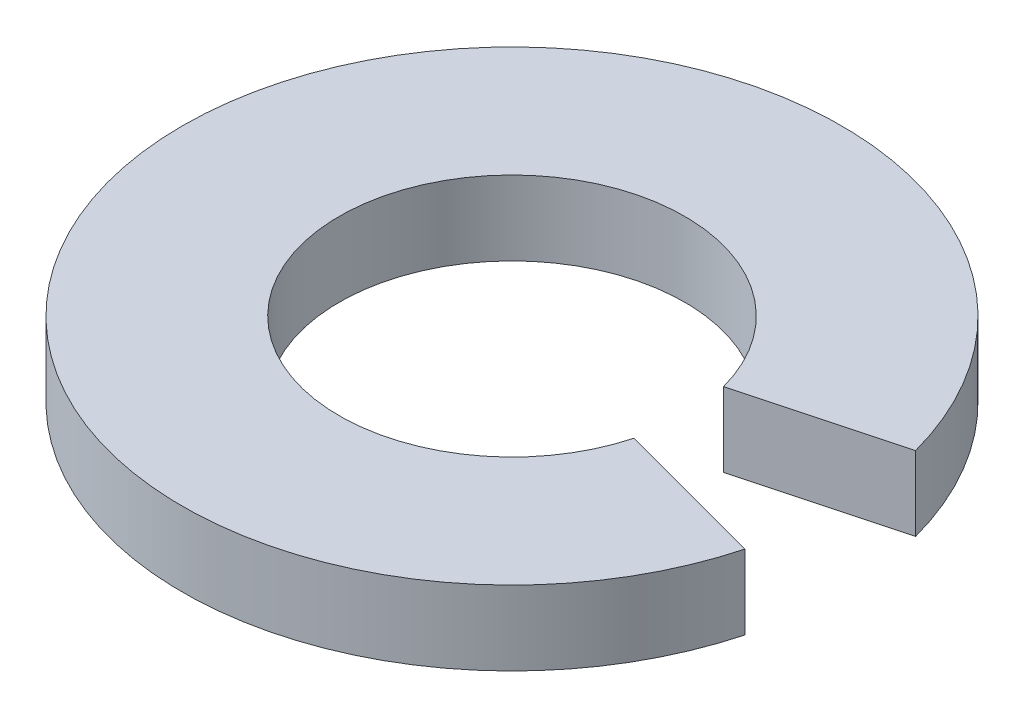
ISO-10303-21;
HEADER;
FILE_DESCRIPTION(('STEP AP214'),'2;1');
FILE_NAME('part.step','',(''),(''),'','','');
FILE_SCHEMA(('AUTOMOTIVE_DESIGN { 1 0 10303 214 1 1 1 1 }'));
ENDSEC;
DATA;
#1=APPLICATION_CONTEXT('core data for automotive mechanical design processes');
#2=APPLICATION_PROTOCOL_DEFINITION('international standard','automotive_design',2000,#1);
#3=PRODUCT_CONTEXT('',#1,'mechanical');
#4=PRODUCT('Part','Part','',(#3));
#5=PRODUCT_RELATED_PRODUCT_CATEGORY('part','',(#4));
#6=PRODUCT_DEFINITION_FORMATION('','',#4);
#7=PRODUCT_DEFINITION_CONTEXT('part definition',#1,'design');
#8=PRODUCT_DEFINITION('design','',#6,#7);
#9=PRODUCT_DEFINITION_SHAPE('','',#8);
#10=(LENGTH_UNIT() NAMED_UNIT(*) SI_UNIT(.MILLI.,.METRE.));
#11=(NAMED_UNIT(*) PLANE_ANGLE_UNIT() SI_UNIT($,.RADIAN.));
#12=(NAMED_UNIT(*) SI_UNIT($,.STERADIAN.) SOLID_ANGLE_UNIT());
#13=UNCERTAINTY_MEASURE_WITH_UNIT(LENGTH_MEASURE(1.E-05),#10,'distance_accuracy_value','');
#14=(GEOMETRIC_REPRESENTATION_CONTEXT(3) GLOBAL_UNCERTAINTY_ASSIGNED_CONTEXT((#13)) GLOBAL_UNIT_ASSIGNED_CONTEXT((#10,
#11,#12)) REPRESENTATION_CONTEXT('',''));
#15=CARTESIAN_POINT('',(0.,0.,0.));
#16=DIRECTION('',(0.,0.,1.));
#17=DIRECTION('',(1.,0.,0.));
#18=AXIS2_PLACEMENT_3D('',#15,#16,#17);
#19=CARTESIAN_POINT('',(0.,0.7,0.));
#20=DIRECTION('',(0.,1.,0.));
#21=DIRECTION('',(0.,0.,1.));
#22=AXIS2_PLACEMENT_3D('',#19,#20,#21);
#23=PLANE('',#22);
#24=CARTESIAN_POINT('',(0.,0.7,0.));
#25=DIRECTION('',(0.,1.,0.));
#26=DIRECTION('',(0.,0.,1.));
#27=AXIS2_PLACEMENT_3D('',#24,#25,#26);
#28=CIRCLE('',#27,1.625);
#29=CARTESIAN_POINT('',(1.56962946771974,0.7,0.420580948291592));
#30=VERTEX_POINT('',#29);
#31=CARTESIAN_POINT('',(1.56962946771975,0.7,-0.420580948291534));
#32=VERTEX_POINT('',#31);
#33=EDGE_CURVE('E68',#30,#32,#28,.F.);
#34=ORIENTED_EDGE('',*,*,#33,.T.);
#35=DIRECTION('',(0.965925826289076,0.,-0.258819045102493));
#36=VECTOR('',#35,1.);
#37=CARTESIAN_POINT('',(1.56962946772,0.7,-0.4205809482916));
#38=LINE('',#37,#36);
#39=CARTESIAN_POINT('',(2.99437006149612,0.7,-0.802339039817771));
#40=VERTEX_POINT('',#39);
#41=EDGE_CURVE('E66',#40,#32,#38,.F.);
#42=ORIENTED_EDGE('',*,*,#41,.F.);
#43=CARTESIAN_POINT('',(0.,0.7,0.));
#44=DIRECTION('',(0.,1.,0.));
#45=DIRECTION('',(0.,0.,1.));
#46=AXIS2_PLACEMENT_3D('',#43,#44,#45);
#47=CIRCLE('',#46,3.1);
#48=CARTESIAN_POINT('',(2.99437006149605,0.7,0.802339039817815));
#49=VERTEX_POINT('',#48);
#50=EDGE_CURVE('E20',#49,#40,#47,.F.);
#51=ORIENTED_EDGE('',*,*,#50,.F.);
#52=DIRECTION('',(-0.965925826289076,0.,-0.258819045102493));
#53=VECTOR('',#52,1.);
#54=CARTESIAN_POINT('',(2.994370061496,0.7,0.8023390398178));
#55=LINE('',#54,#53);
#56=EDGE_CURVE('E53',#30,#49,#55,.F.);
#57=ORIENTED_EDGE('',*,*,#56,.F.);
#58=EDGE_LOOP('',(#34,#42,#51,#57));
#59=FACE_BOUND('',#58,.T.);
#60=ADVANCED_FACE('F17',(#59),#23,.T.);
#61=CARTESIAN_POINT('',(1.56962946772,0.,-0.4205809482916));
#62=DIRECTION('',(0.258819045102493,0.,0.965925826289076));
#63=DIRECTION('',(0.965925826289076,0.,-0.258819045102493));
#64=AXIS2_PLACEMENT_3D('',#61,#62,#63);
#65=PLANE('',#64);
#66=DIRECTION('',(0.,1.,0.));
#67=VECTOR('',#66,1.);
#68=CARTESIAN_POINT('',(1.56962946771975,0.,-0.420580948291534));
#69=LINE('',#68,#67);
#70=CARTESIAN_POINT('',(1.56962946771975,0.,-0.420580948291534));
#71=VERTEX_POINT('',#70);
#72=EDGE_CURVE('E82',#32,#71,#69,.F.);
#73=ORIENTED_EDGE('',*,*,#72,.T.);
#74=DIRECTION('',(0.965925826289054,0.,-0.258819045102573));
#75=VECTOR('',#74,1.);
#76=CARTESIAN_POINT('',(1.56962946772,0.,-0.4205809482916));
#77=LINE('',#76,#75);
#78=CARTESIAN_POINT('',(2.99437006149611,0.,-0.802339039817829));
#79=VERTEX_POINT('',#78);
#80=EDGE_CURVE('E75',#71,#79,#77,.T.);
#81=ORIENTED_EDGE('',*,*,#80,.T.);
#82=DIRECTION('',(0.,1.,0.));
#83=VECTOR('',#82,1.);
#84=CARTESIAN_POINT('',(2.99437006149611,0.,-0.802339039817829));
#85=LINE('',#84,#83);
#86=EDGE_CURVE('E62',#40,#79,#85,.F.);
#87=ORIENTED_EDGE('',*,*,#86,.F.);
#88=ORIENTED_EDGE('',*,*,#41,.T.);
#89=EDGE_LOOP('',(#73,#81,#87,#88));
#90=FACE_BOUND('',#89,.T.);
#91=ADVANCED_FACE('F74',(#90),#65,.T.);
#92=CARTESIAN_POINT('',(0.,0.,0.));
#93=DIRECTION('',(0.,1.,0.));
#94=DIRECTION('',(0.,0.,1.));
#95=AXIS2_PLACEMENT_3D('',#92,#93,#94);
#96=CYLINDRICAL_SURFACE('',#95,3.1);
#97=ORIENTED_EDGE('',*,*,#86,.T.);
#98=CARTESIAN_POINT('',(0.,0.,0.));
#99=DIRECTION('',(0.,1.,0.));
#100=DIRECTION('',(0.,0.,1.));
#101=AXIS2_PLACEMENT_3D('',#98,#99,#100);
#102=CIRCLE('',#101,3.1);
#103=CARTESIAN_POINT('',(2.99437006149605,0.,0.802339039817814));
#104=VERTEX_POINT('',#103);
#105=EDGE_CURVE('E81',#79,#104,#102,.T.);
#106=ORIENTED_EDGE('',*,*,#105,.T.);
#107=DIRECTION('',(0.,1.,0.));
#108=VECTOR('',#107,1.);
#109=CARTESIAN_POINT('',(2.994370061496,0.,0.8023390398178));
#110=LINE('',#109,#108);
#111=EDGE_CURVE('E64',#49,#104,#110,.F.);
#112=ORIENTED_EDGE('',*,*,#111,.F.);
#113=ORIENTED_EDGE('',*,*,#50,.T.);
#114=EDGE_LOOP('',(#97,#106,#112,#113));
#115=FACE_BOUND('',#114,.T.);
#116=ADVANCED_FACE('F59',(#115),#96,.T.);
#117=CARTESIAN_POINT('',(2.994370061496,0.,0.8023390398178));
#118=DIRECTION('',(0.258819045102493,0.,-0.965925826289076));
#119=DIRECTION('',(-0.965925826289076,0.,-0.258819045102493));
#120=AXIS2_PLACEMENT_3D('',#117,#118,#119);
#121=PLANE('',#120);
#122=ORIENTED_EDGE('',*,*,#111,.T.);
#123=DIRECTION('',(-0.965925826289054,0.,-0.258819045102573));
#124=VECTOR('',#123,1.);
#125=CARTESIAN_POINT('',(2.994370061496,0.,0.8023390398178));
#126=LINE('',#125,#124);
#127=CARTESIAN_POINT('',(1.56962946771975,0.,0.420580948291534));
#128=VERTEX_POINT('',#127);
#129=EDGE_CURVE('E26',#104,#128,#126,.T.);
#130=ORIENTED_EDGE('',*,*,#129,.T.);
#131=DIRECTION('',(0.,1.,0.));
#132=VECTOR('',#131,1.);
#133=CARTESIAN_POINT('',(1.56962946771975,0.,0.420580948291534));
#134=LINE('',#133,#132);
#135=EDGE_CURVE('E34',#128,#30,#134,.T.);
#136=ORIENTED_EDGE('',*,*,#135,.T.);
#137=ORIENTED_EDGE('',*,*,#56,.T.);
#138=EDGE_LOOP('',(#122,#130,#136,#137));
#139=FACE_BOUND('',#138,.T.);
#140=ADVANCED_FACE('F88',(#139),#121,.T.);
#141=CARTESIAN_POINT('',(0.,0.,0.));
#142=DIRECTION('',(0.,1.,0.));
#143=DIRECTION('',(0.,0.,1.));
#144=AXIS2_PLACEMENT_3D('',#141,#142,#143);
#145=CYLINDRICAL_SURFACE('',#144,1.625);
#146=ORIENTED_EDGE('',*,*,#33,.F.);
#147=ORIENTED_EDGE('',*,*,#135,.F.);
#148=CARTESIAN_POINT('',(0.,0.,0.));
#149=DIRECTION('',(0.,1.,0.));
#150=DIRECTION('',(0.,0.,1.));
#151=AXIS2_PLACEMENT_3D('',#148,#149,#150);
#152=CIRCLE('',#151,1.625);
#153=EDGE_CURVE('E11',#128,#71,#152,.F.);
#154=ORIENTED_EDGE('',*,*,#153,.T.);
#155=ORIENTED_EDGE('',*,*,#72,.F.);
#156=EDGE_LOOP('',(#146,#147,#154,#155));
#157=FACE_BOUND('',#156,.T.);
#158=ADVANCED_FACE('F91',(#157),#145,.F.);
#159=CARTESIAN_POINT('',(0.,0.,0.));
#160=DIRECTION('',(0.,1.,0.));
#161=DIRECTION('',(0.,0.,1.));
#162=AXIS2_PLACEMENT_3D('',#159,#160,#161);
#163=PLANE('',#162);
#164=ORIENTED_EDGE('',*,*,#129,.F.);
#165=ORIENTED_EDGE('',*,*,#105,.F.);
#166=ORIENTED_EDGE('',*,*,#80,.F.);
#167=ORIENTED_EDGE('',*,*,#153,.F.);
#168=EDGE_LOOP('',(#164,#165,#166,#167));
#169=FACE_BOUND('',#168,.T.);
#170=ADVANCED_FACE('F90',(#169),#163,.F.);
#171=CLOSED_SHELL('',(#60,#91,#116,#140,#158,#170));
#172=MANIFOLD_SOLID_BREP('B1',#171);
#173=ADVANCED_BREP_SHAPE_REPRESENTATION('',(#18,#172),#14);
#174=SHAPE_DEFINITION_REPRESENTATION(#9,#173);
ENDSEC;
END-ISO-10303-21;
